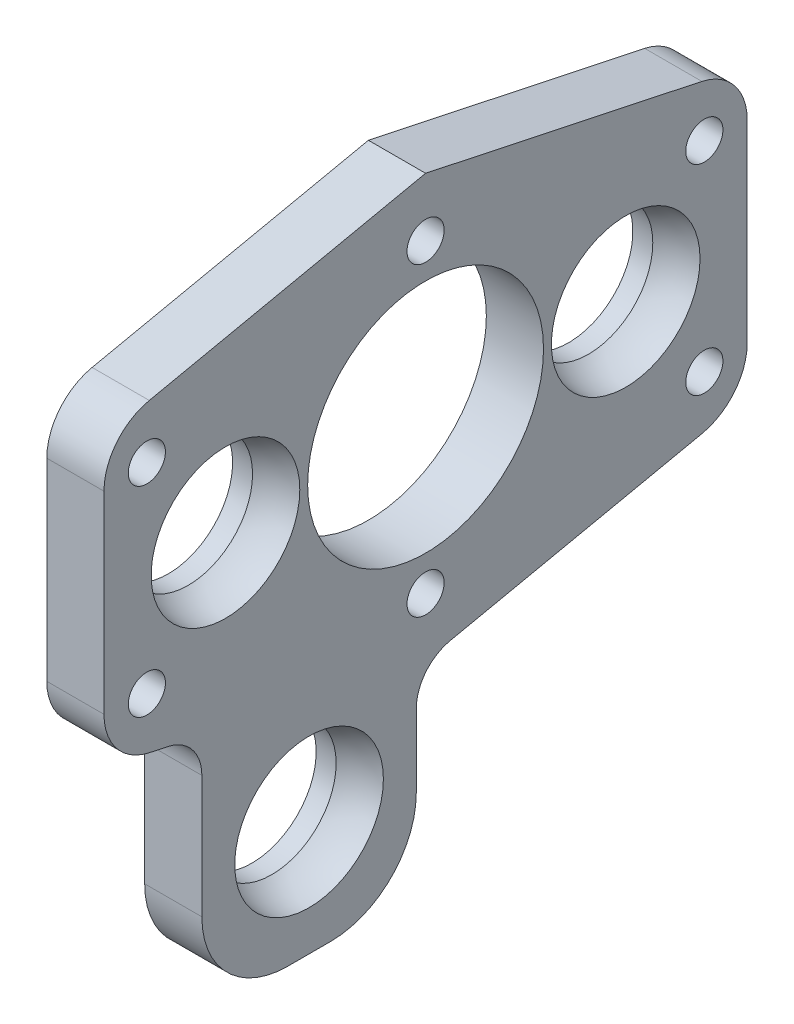
ISO-10303-21;
HEADER;
FILE_DESCRIPTION(('STEP AP214'),'2;1');
FILE_NAME('part.step','',(''),(''),'','','');
FILE_SCHEMA(('AUTOMOTIVE_DESIGN { 1 0 10303 214 1 1 1 1 }'));
ENDSEC;
DATA;
#1=APPLICATION_CONTEXT('core data for automotive mechanical design processes');
#2=APPLICATION_PROTOCOL_DEFINITION('international standard','automotive_design',2000,#1);
#3=PRODUCT_CONTEXT('',#1,'mechanical');
#4=PRODUCT('Part','Part','',(#3));
#5=PRODUCT_RELATED_PRODUCT_CATEGORY('part','',(#4));
#6=PRODUCT_DEFINITION_FORMATION('','',#4);
#7=PRODUCT_DEFINITION_CONTEXT('part definition',#1,'design');
#8=PRODUCT_DEFINITION('design','',#6,#7);
#9=PRODUCT_DEFINITION_SHAPE('','',#8);
#10=(LENGTH_UNIT() NAMED_UNIT(*) SI_UNIT(.MILLI.,.METRE.));
#11=(NAMED_UNIT(*) PLANE_ANGLE_UNIT() SI_UNIT($,.RADIAN.));
#12=(NAMED_UNIT(*) SI_UNIT($,.STERADIAN.) SOLID_ANGLE_UNIT());
#13=UNCERTAINTY_MEASURE_WITH_UNIT(LENGTH_MEASURE(1.E-05),#10,'distance_accuracy_value','');
#14=(GEOMETRIC_REPRESENTATION_CONTEXT(3) GLOBAL_UNCERTAINTY_ASSIGNED_CONTEXT((#13)) GLOBAL_UNIT_ASSIGNED_CONTEXT((#10,
#11,#12)) REPRESENTATION_CONTEXT('',''));
#15=CARTESIAN_POINT('',(0.,0.,0.));
#16=DIRECTION('',(0.,0.,1.));
#17=DIRECTION('',(1.,0.,0.));
#18=AXIS2_PLACEMENT_3D('',#15,#16,#17);
#19=CARTESIAN_POINT('',(4.,-28.2690306373786,-5.99265255801159));
#20=DIRECTION('',(0.,0.978260869565218,0.207378087264554));
#21=DIRECTION('',(0.,-0.207378087264554,0.978260869565218));
#22=AXIS2_PLACEMENT_3D('',#19,#20,#21);
#23=PLANE('',#22);
#24=DIRECTION('',(0.,0.207378087264554,-0.978260869565218));
#25=VECTOR('',#24,1.);
#26=CARTESIAN_POINT('',(4.,-28.2690306373786,-5.99265255801159));
#27=LINE('',#26,#25);
#28=CARTESIAN_POINT('',(4.,-24.4038726556208,-24.2256918251629));
#29=VERTEX_POINT('',#28);
#30=CARTESIAN_POINT('',(4.,-20.672100546187,-41.8295123490582));
#31=VERTEX_POINT('',#30);
#32=EDGE_CURVE('E186',#29,#31,#27,.T.);
#33=ORIENTED_EDGE('',*,*,#32,.F.);
#34=DIRECTION('',(-1.,0.,0.));
#35=VECTOR('',#34,1.);
#36=CARTESIAN_POINT('',(4.,-24.4038726556208,-24.2256918251629));
#37=LINE('',#36,#35);
#38=CARTESIAN_POINT('',(0.,-24.4038726556208,-24.2256918251629));
#39=VERTEX_POINT('',#38);
#40=EDGE_CURVE('E321',#29,#39,#37,.T.);
#41=ORIENTED_EDGE('',*,*,#40,.T.);
#42=DIRECTION('',(0.,0.207378087264554,-0.978260869565218));
#43=VECTOR('',#42,1.);
#44=CARTESIAN_POINT('',(0.,-28.2690306373786,-5.99265255801159));
#45=LINE('',#44,#43);
#46=CARTESIAN_POINT('',(0.,-20.672100546187,-41.8295123490582));
#47=VERTEX_POINT('',#46);
#48=EDGE_CURVE('E212',#39,#47,#45,.T.);
#49=ORIENTED_EDGE('',*,*,#48,.T.);
#50=DIRECTION('',(-1.,0.,0.));
#51=VECTOR('',#50,1.);
#52=CARTESIAN_POINT('',(4.,-20.672100546187,-41.8295123490582));
#53=LINE('',#52,#51);
#54=EDGE_CURVE('E307',#47,#31,#53,.F.);
#55=ORIENTED_EDGE('',*,*,#54,.T.);
#56=EDGE_LOOP('',(#33,#41,#49,#55));
#57=FACE_BOUND('',#56,.T.);
#58=ADVANCED_FACE('F35',(#57),#23,.F.);
#59=CARTESIAN_POINT('',(4.,0.,-45.));
#60=DIRECTION('',(0.,0.,-1.));
#61=DIRECTION('',(-1.,0.,0.));
#62=AXIS2_PLACEMENT_3D('',#59,#60,#61);
#63=PLANE('',#62);
#64=DIRECTION('',(0.,-1.,0.));
#65=VECTOR('',#64,1.);
#66=CARTESIAN_POINT('',(4.,0.,-45.));
#67=LINE('',#66,#65);
#68=CARTESIAN_POINT('',(4.,-3.24094293207383,-45.));
#69=VERTEX_POINT('',#68);
#70=CARTESIAN_POINT('',(4.,-16.7590570679262,-45.));
#71=VERTEX_POINT('',#70);
#72=EDGE_CURVE('E183',#69,#71,#67,.T.);
#73=ORIENTED_EDGE('',*,*,#72,.T.);
#74=DIRECTION('',(-1.,0.,0.));
#75=VECTOR('',#74,1.);
#76=CARTESIAN_POINT('',(0.,-16.7590570679262,-45.));
#77=LINE('',#76,#75);
#78=CARTESIAN_POINT('',(0.,-16.7590570679262,-45.));
#79=VERTEX_POINT('',#78);
#80=EDGE_CURVE('E304',#71,#79,#77,.T.);
#81=ORIENTED_EDGE('',*,*,#80,.T.);
#82=DIRECTION('',(0.,-1.,0.));
#83=VECTOR('',#82,1.);
#84=CARTESIAN_POINT('',(0.,0.,-45.));
#85=LINE('',#84,#83);
#86=CARTESIAN_POINT('',(0.,-3.24094293207383,-45.));
#87=VERTEX_POINT('',#86);
#88=EDGE_CURVE('E214',#87,#79,#85,.T.);
#89=ORIENTED_EDGE('',*,*,#88,.F.);
#90=DIRECTION('',(-1.,0.,0.));
#91=VECTOR('',#90,1.);
#92=CARTESIAN_POINT('',(4.,-3.24094293207383,-45.));
#93=LINE('',#92,#91);
#94=EDGE_CURVE('E302',#87,#69,#93,.F.);
#95=ORIENTED_EDGE('',*,*,#94,.T.);
#96=EDGE_LOOP('',(#73,#81,#89,#95));
#97=FACE_BOUND('',#96,.T.);
#98=ADVANCED_FACE('F339',(#97),#63,.T.);
#99=CARTESIAN_POINT('',(4.,9.12914405892871,-1.93525519848772));
#100=DIRECTION('',(0.,0.978260869565218,-0.207378087264554));
#101=DIRECTION('',(0.,0.207378087264554,0.978260869565218));
#102=AXIS2_PLACEMENT_3D('',#99,#100,#101);
#103=PLANE('',#102);
#104=DIRECTION('',(0.,-0.207378087264554,-0.978260869565218));
#105=VECTOR('',#104,1.);
#106=CARTESIAN_POINT('',(4.,9.12914405892871,-1.93525519848772));
#107=LINE('',#106,#105);
#108=CARTESIAN_POINT('',(4.,4.76969600708473,-22.5));
#109=VERTEX_POINT('',#108);
#110=CARTESIAN_POINT('',(4.,0.672100546187042,-41.8295123490582));
#111=VERTEX_POINT('',#110);
#112=EDGE_CURVE('E166',#109,#111,#107,.T.);
#113=ORIENTED_EDGE('',*,*,#112,.T.);
#114=DIRECTION('',(-1.,0.,0.));
#115=VECTOR('',#114,1.);
#116=CARTESIAN_POINT('',(4.,0.672100546187044,-41.8295123490582));
#117=LINE('',#116,#115);
#118=CARTESIAN_POINT('',(0.,0.672100546187042,-41.8295123490582));
#119=VERTEX_POINT('',#118);
#120=EDGE_CURVE('E310',#111,#119,#117,.T.);
#121=ORIENTED_EDGE('',*,*,#120,.T.);
#122=DIRECTION('',(0.,-0.207378087264554,-0.978260869565218));
#123=VECTOR('',#122,1.);
#124=CARTESIAN_POINT('',(0.,9.12914405892871,-1.93525519848772));
#125=LINE('',#124,#123);
#126=CARTESIAN_POINT('',(0.,4.76969600708473,-22.5));
#127=VERTEX_POINT('',#126);
#128=EDGE_CURVE('E174',#127,#119,#125,.T.);
#129=ORIENTED_EDGE('',*,*,#128,.F.);
#130=DIRECTION('',(-1.,0.,0.));
#131=VECTOR('',#130,1.);
#132=CARTESIAN_POINT('',(4.,4.76969600708473,-22.5));
#133=LINE('',#132,#131);
#134=EDGE_CURVE('E158',#109,#127,#133,.T.);
#135=ORIENTED_EDGE('',*,*,#134,.F.);
#136=EDGE_LOOP('',(#113,#121,#129,#135));
#137=FACE_BOUND('',#136,.T.);
#138=ADVANCED_FACE('F170',(#137),#103,.T.);
#139=CARTESIAN_POINT('',(4.,0.,0.));
#140=DIRECTION('',(0.,0.978260869565218,0.207378087264554));
#141=DIRECTION('',(0.,-0.207378087264554,0.978260869565218));
#142=AXIS2_PLACEMENT_3D('',#139,#140,#141);
#143=PLANE('',#142);
#144=DIRECTION('',(0.,0.207378087264554,-0.978260869565218));
#145=VECTOR('',#144,1.);
#146=CARTESIAN_POINT('',(0.,0.,0.));
#147=LINE('',#146,#145);
#148=CARTESIAN_POINT('',(0.,0.672100546187044,-3.17048765094179));
#149=VERTEX_POINT('',#148);
#150=EDGE_CURVE('E219',#149,#127,#147,.T.);
#151=ORIENTED_EDGE('',*,*,#150,.F.);
#152=DIRECTION('',(-1.,0.,0.));
#153=VECTOR('',#152,1.);
#154=CARTESIAN_POINT('',(4.,0.672100546187044,-3.17048765094179));
#155=LINE('',#154,#153);
#156=CARTESIAN_POINT('',(4.,0.672100546187044,-3.17048765094179));
#157=VERTEX_POINT('',#156);
#158=EDGE_CURVE('E161',#149,#157,#155,.F.);
#159=ORIENTED_EDGE('',*,*,#158,.T.);
#160=DIRECTION('',(0.,0.207378087264554,-0.978260869565218));
#161=VECTOR('',#160,1.);
#162=CARTESIAN_POINT('',(4.,0.,0.));
#163=LINE('',#162,#161);
#164=EDGE_CURVE('E154',#157,#109,#163,.T.);
#165=ORIENTED_EDGE('',*,*,#164,.T.);
#166=ORIENTED_EDGE('',*,*,#134,.T.);
#167=EDGE_LOOP('',(#151,#159,#165,#166));
#168=FACE_BOUND('',#167,.T.);
#169=ADVANCED_FACE('F157',(#168),#143,.T.);
#170=CARTESIAN_POINT('',(4.,0.,0.));
#171=DIRECTION('',(0.,0.,-1.));
#172=DIRECTION('',(0.,1.,0.));
#173=AXIS2_PLACEMENT_3D('',#170,#171,#172);
#174=PLANE('',#173);
#175=DIRECTION('',(0.,-1.,0.));
#176=VECTOR('',#175,1.);
#177=CARTESIAN_POINT('',(4.,0.,0.));
#178=LINE('',#177,#176);
#179=CARTESIAN_POINT('',(4.,-3.24094293207383,0.));
#180=VERTEX_POINT('',#179);
#181=CARTESIAN_POINT('',(4.,-16.7590570679262,0.));
#182=VERTEX_POINT('',#181);
#183=EDGE_CURVE('E165',#180,#182,#178,.T.);
#184=ORIENTED_EDGE('',*,*,#183,.F.);
#185=DIRECTION('',(-1.,0.,0.));
#186=VECTOR('',#185,1.);
#187=CARTESIAN_POINT('',(0.,-3.24094293207383,0.));
#188=LINE('',#187,#186);
#189=CARTESIAN_POINT('',(0.,-3.24094293207383,0.));
#190=VERTEX_POINT('',#189);
#191=EDGE_CURVE('E279',#180,#190,#188,.T.);
#192=ORIENTED_EDGE('',*,*,#191,.T.);
#193=DIRECTION('',(0.,-1.,0.));
#194=VECTOR('',#193,1.);
#195=CARTESIAN_POINT('',(0.,0.,0.));
#196=LINE('',#195,#194);
#197=CARTESIAN_POINT('',(0.,-16.7590570679262,0.));
#198=VERTEX_POINT('',#197);
#199=EDGE_CURVE('E221',#190,#198,#196,.T.);
#200=ORIENTED_EDGE('',*,*,#199,.T.);
#201=DIRECTION('',(-1.,0.,0.));
#202=VECTOR('',#201,1.);
#203=CARTESIAN_POINT('',(4.,-16.7590570679262,0.));
#204=LINE('',#203,#202);
#205=EDGE_CURVE('E277',#198,#182,#204,.F.);
#206=ORIENTED_EDGE('',*,*,#205,.T.);
#207=EDGE_LOOP('',(#184,#192,#200,#206));
#208=FACE_BOUND('',#207,.T.);
#209=ADVANCED_FACE('F349',(#208),#174,.F.);
#210=CARTESIAN_POINT('',(4.,-3.,-3.));
#211=DIRECTION('',(-1.,0.,0.));
#212=DIRECTION('',(0.,0.,1.));
#213=AXIS2_PLACEMENT_3D('',#210,#211,#212);
#214=CYLINDRICAL_SURFACE('',#213,1.3);
#215=CARTESIAN_POINT('',(4.,-3.,-3.));
#216=DIRECTION('',(1.,0.,0.));
#217=DIRECTION('',(0.,0.,-1.));
#218=AXIS2_PLACEMENT_3D('',#215,#216,#217);
#219=CIRCLE('',#218,1.3);
#220=CARTESIAN_POINT('',(4.,-3.,-4.3));
#221=VERTEX_POINT('',#220);
#222=EDGE_CURVE('E207',#221,#221,#219,.T.);
#223=ORIENTED_EDGE('',*,*,#222,.T.);
#224=EDGE_LOOP('',(#223));
#225=FACE_BOUND('',#224,.T.);
#226=CARTESIAN_POINT('',(0.,-3.,-3.));
#227=DIRECTION('',(1.,0.,0.));
#228=DIRECTION('',(0.,0.,-1.));
#229=AXIS2_PLACEMENT_3D('',#226,#227,#228);
#230=CIRCLE('',#229,1.3);
#231=CARTESIAN_POINT('',(0.,-3.,-4.3));
#232=VERTEX_POINT('',#231);
#233=EDGE_CURVE('E239',#232,#232,#230,.T.);
#234=ORIENTED_EDGE('',*,*,#233,.F.);
#235=EDGE_LOOP('',(#234));
#236=FACE_BOUND('',#235,.T.);
#237=ADVANCED_FACE('F489',(#225,#236),#214,.F.);
#238=CARTESIAN_POINT('',(4.,-3.,-42.));
#239=DIRECTION('',(-1.,0.,0.));
#240=DIRECTION('',(0.,0.,1.));
#241=AXIS2_PLACEMENT_3D('',#238,#239,#240);
#242=CYLINDRICAL_SURFACE('',#241,1.29999999999999);
#243=CARTESIAN_POINT('',(4.,-3.,-42.));
#244=DIRECTION('',(1.,0.,0.));
#245=DIRECTION('',(0.,0.,-1.));
#246=AXIS2_PLACEMENT_3D('',#243,#244,#245);
#247=CIRCLE('',#246,1.29999999999999);
#248=CARTESIAN_POINT('',(4.,-3.,-43.3));
#249=VERTEX_POINT('',#248);
#250=EDGE_CURVE('E204',#249,#249,#247,.T.);
#251=ORIENTED_EDGE('',*,*,#250,.T.);
#252=EDGE_LOOP('',(#251));
#253=FACE_BOUND('',#252,.T.);
#254=CARTESIAN_POINT('',(0.,-3.,-42.));
#255=DIRECTION('',(1.,0.,0.));
#256=DIRECTION('',(0.,0.,-1.));
#257=AXIS2_PLACEMENT_3D('',#254,#255,#256);
#258=CIRCLE('',#257,1.29999999999999);
#259=CARTESIAN_POINT('',(0.,-3.,-43.3));
#260=VERTEX_POINT('',#259);
#261=EDGE_CURVE('E236',#260,#260,#258,.T.);
#262=ORIENTED_EDGE('',*,*,#261,.F.);
#263=EDGE_LOOP('',(#262));
#264=FACE_BOUND('',#263,.T.);
#265=ADVANCED_FACE('F492',(#253,#264),#242,.F.);
#266=CARTESIAN_POINT('',(4.,-17.,-42.0000000000003));
#267=DIRECTION('',(-1.,0.,0.));
#268=DIRECTION('',(0.,0.,1.));
#269=AXIS2_PLACEMENT_3D('',#266,#267,#268);
#270=CYLINDRICAL_SURFACE('',#269,1.3);
#271=CARTESIAN_POINT('',(4.,-17.,-42.0000000000003));
#272=DIRECTION('',(1.,0.,0.));
#273=DIRECTION('',(0.,0.,-1.));
#274=AXIS2_PLACEMENT_3D('',#271,#272,#273);
#275=CIRCLE('',#274,1.3);
#276=CARTESIAN_POINT('',(4.,-17.,-43.3000000000003));
#277=VERTEX_POINT('',#276);
#278=EDGE_CURVE('E201',#277,#277,#275,.T.);
#279=ORIENTED_EDGE('',*,*,#278,.T.);
#280=EDGE_LOOP('',(#279));
#281=FACE_BOUND('',#280,.T.);
#282=CARTESIAN_POINT('',(0.,-17.,-42.0000000000003));
#283=DIRECTION('',(1.,0.,0.));
#284=DIRECTION('',(0.,0.,-1.));
#285=AXIS2_PLACEMENT_3D('',#282,#283,#284);
#286=CIRCLE('',#285,1.3);
#287=CARTESIAN_POINT('',(0.,-17.,-43.3000000000003));
#288=VERTEX_POINT('',#287);
#289=EDGE_CURVE('E233',#288,#288,#286,.T.);
#290=ORIENTED_EDGE('',*,*,#289,.F.);
#291=EDGE_LOOP('',(#290));
#292=FACE_BOUND('',#291,.T.);
#293=ADVANCED_FACE('F496',(#281,#292),#270,.F.);
#294=CARTESIAN_POINT('',(4.,-17.,-3.00000000000015));
#295=DIRECTION('',(-1.,0.,0.));
#296=DIRECTION('',(0.,0.,1.));
#297=AXIS2_PLACEMENT_3D('',#294,#295,#296);
#298=CYLINDRICAL_SURFACE('',#297,1.3);
#299=CARTESIAN_POINT('',(4.,-17.,-3.00000000000015));
#300=DIRECTION('',(1.,0.,0.));
#301=DIRECTION('',(0.,0.,-1.));
#302=AXIS2_PLACEMENT_3D('',#299,#300,#301);
#303=CIRCLE('',#302,1.3);
#304=CARTESIAN_POINT('',(4.,-17.,-4.30000000000015));
#305=VERTEX_POINT('',#304);
#306=EDGE_CURVE('E198',#305,#305,#303,.T.);
#307=ORIENTED_EDGE('',*,*,#306,.T.);
#308=EDGE_LOOP('',(#307));
#309=FACE_BOUND('',#308,.T.);
#310=CARTESIAN_POINT('',(0.,-17.,-3.00000000000015));
#311=DIRECTION('',(1.,0.,0.));
#312=DIRECTION('',(0.,0.,-1.));
#313=AXIS2_PLACEMENT_3D('',#310,#311,#312);
#314=CIRCLE('',#313,1.3);
#315=CARTESIAN_POINT('',(0.,-17.,-4.30000000000015));
#316=VERTEX_POINT('',#315);
#317=EDGE_CURVE('E230',#316,#316,#314,.T.);
#318=ORIENTED_EDGE('',*,*,#317,.F.);
#319=EDGE_LOOP('',(#318));
#320=FACE_BOUND('',#319,.T.);
#321=ADVANCED_FACE('F500',(#309,#320),#298,.F.);
#322=CARTESIAN_POINT('',(4.,-20.6808071181958,-22.5));
#323=DIRECTION('',(-1.,0.,0.));
#324=DIRECTION('',(0.,0.,1.));
#325=AXIS2_PLACEMENT_3D('',#322,#323,#324);
#326=CYLINDRICAL_SURFACE('',#325,1.3);
#327=CARTESIAN_POINT('',(4.,-20.6808071181958,-22.5));
#328=DIRECTION('',(1.,0.,0.));
#329=DIRECTION('',(0.,0.,-1.));
#330=AXIS2_PLACEMENT_3D('',#327,#328,#329);
#331=CIRCLE('',#330,1.3);
#332=CARTESIAN_POINT('',(4.,-20.6808071181958,-23.8));
#333=VERTEX_POINT('',#332);
#334=EDGE_CURVE('E195',#333,#333,#331,.T.);
#335=ORIENTED_EDGE('',*,*,#334,.T.);
#336=EDGE_LOOP('',(#335));
#337=FACE_BOUND('',#336,.T.);
#338=CARTESIAN_POINT('',(0.,-20.6808071181958,-22.5));
#339=DIRECTION('',(1.,0.,0.));
#340=DIRECTION('',(0.,0.,-1.));
#341=AXIS2_PLACEMENT_3D('',#338,#339,#340);
#342=CIRCLE('',#341,1.3);
#343=CARTESIAN_POINT('',(0.,-20.6808071181958,-23.8));
#344=VERTEX_POINT('',#343);
#345=EDGE_CURVE('E227',#344,#344,#342,.T.);
#346=ORIENTED_EDGE('',*,*,#345,.F.);
#347=EDGE_LOOP('',(#346));
#348=FACE_BOUND('',#347,.T.);
#349=ADVANCED_FACE('F504',(#337,#348),#326,.F.);
#350=CARTESIAN_POINT('',(4.,-19.1398865784499,4.05739735952387));
#351=DIRECTION('',(0.,0.978260869565218,-0.207378087264554));
#352=DIRECTION('',(0.,0.207378087264554,0.978260869565218));
#353=AXIS2_PLACEMENT_3D('',#350,#351,#352);
#354=PLANE('',#353);
#355=DIRECTION('',(0.,-0.207378087264554,-0.978260869565218));
#356=VECTOR('',#355,1.);
#357=CARTESIAN_POINT('',(0.,-19.1398865784499,4.05739735952387));
#358=LINE('',#357,#356);
#359=CARTESIAN_POINT('',(0.,-20.672100546187,-3.17048765094179));
#360=VERTEX_POINT('',#359);
#361=CARTESIAN_POINT('',(0.,-20.9475712012116,-4.46996034875019));
#362=VERTEX_POINT('',#361);
#363=EDGE_CURVE('E224',#360,#362,#358,.T.);
#364=ORIENTED_EDGE('',*,*,#363,.T.);
#365=DIRECTION('',(1.,0.,0.));
#366=VECTOR('',#365,1.);
#367=CARTESIAN_POINT('',(4.,-20.9475712012116,-4.46996034875019));
#368=LINE('',#367,#366);
#369=CARTESIAN_POINT('',(4.,-20.9475712012116,-4.46996034875019));
#370=VERTEX_POINT('',#369);
#371=EDGE_CURVE('E312',#362,#370,#368,.T.);
#372=ORIENTED_EDGE('',*,*,#371,.T.);
#373=DIRECTION('',(0.,-0.207378087264554,-0.978260869565218));
#374=VECTOR('',#373,1.);
#375=CARTESIAN_POINT('',(4.,-19.1398865784499,4.05739735952387));
#376=LINE('',#375,#374);
#377=CARTESIAN_POINT('',(4.,-20.672100546187,-3.17048765094179));
#378=VERTEX_POINT('',#377);
#379=EDGE_CURVE('E192',#378,#370,#376,.T.);
#380=ORIENTED_EDGE('',*,*,#379,.F.);
#381=DIRECTION('',(-1.,0.,0.));
#382=VECTOR('',#381,1.);
#383=CARTESIAN_POINT('',(4.,-20.672100546187,-3.17048765094179));
#384=LINE('',#383,#382);
#385=EDGE_CURVE('E299',#378,#360,#384,.T.);
#386=ORIENTED_EDGE('',*,*,#385,.T.);
#387=EDGE_LOOP('',(#364,#372,#380,#386));
#388=FACE_BOUND('',#387,.T.);
#389=ADVANCED_FACE('F356',(#388),#354,.F.);
#390=CARTESIAN_POINT('',(4.,0.680807118195841,-22.5));
#391=DIRECTION('',(-1.,0.,0.));
#392=DIRECTION('',(0.,0.,1.));
#393=AXIS2_PLACEMENT_3D('',#390,#391,#392);
#394=CYLINDRICAL_SURFACE('',#393,1.3);
#395=CARTESIAN_POINT('',(4.,0.680807118195841,-22.5));
#396=DIRECTION('',(1.,0.,0.));
#397=DIRECTION('',(0.,0.,-1.));
#398=AXIS2_PLACEMENT_3D('',#395,#396,#397);
#399=CIRCLE('',#398,1.3);
#400=CARTESIAN_POINT('',(4.,0.680807118195841,-23.8));
#401=VERTEX_POINT('',#400);
#402=EDGE_CURVE('E176',#401,#401,#399,.T.);
#403=ORIENTED_EDGE('',*,*,#402,.T.);
#404=EDGE_LOOP('',(#403));
#405=FACE_BOUND('',#404,.T.);
#406=CARTESIAN_POINT('',(0.,0.680807118195841,-22.5));
#407=DIRECTION('',(1.,0.,0.));
#408=DIRECTION('',(0.,0.,-1.));
#409=AXIS2_PLACEMENT_3D('',#406,#407,#408);
#410=CIRCLE('',#409,1.3);
#411=CARTESIAN_POINT('',(0.,0.680807118195841,-23.8));
#412=VERTEX_POINT('',#411);
#413=EDGE_CURVE('E242',#412,#412,#410,.T.);
#414=ORIENTED_EDGE('',*,*,#413,.F.);
#415=EDGE_LOOP('',(#414));
#416=FACE_BOUND('',#415,.T.);
#417=ADVANCED_FACE('F478',(#405,#416),#394,.F.);
#418=CARTESIAN_POINT('',(4.,0.,0.));
#419=DIRECTION('',(1.,0.,0.));
#420=DIRECTION('',(0.,0.,-1.));
#421=AXIS2_PLACEMENT_3D('',#418,#419,#420);
#422=PLANE('',#421);
#423=CARTESIAN_POINT('',(4.,-30.4516466108519,-14.3478260869565));
#424=DIRECTION('',(1.,0.,0.));
#425=DIRECTION('',(0.,0.,-1.));
#426=AXIS2_PLACEMENT_3D('',#423,#424,#425);
#427=CIRCLE('',#426,5.2);
#428=CARTESIAN_POINT('',(4.,-30.4516466108519,-19.5478260869565));
#429=VERTEX_POINT('',#428);
#430=EDGE_CURVE('E257',#429,#429,#427,.T.);
#431=ORIENTED_EDGE('',*,*,#430,.F.);
#432=EDGE_LOOP('',(#431));
#433=FACE_BOUND('',#432,.T.);
#434=CARTESIAN_POINT('',(4.,-10.,-22.5));
#435=DIRECTION('',(1.,0.,0.));
#436=DIRECTION('',(0.,0.,-1.));
#437=AXIS2_PLACEMENT_3D('',#434,#435,#436);
#438=CIRCLE('',#437,8.25);
#439=CARTESIAN_POINT('',(4.,-10.,-30.75));
#440=VERTEX_POINT('',#439);
#441=EDGE_CURVE('E248',#440,#440,#438,.T.);
#442=ORIENTED_EDGE('',*,*,#441,.F.);
#443=EDGE_LOOP('',(#442));
#444=FACE_BOUND('',#443,.T.);
#445=CARTESIAN_POINT('',(4.,-10.,-36.5));
#446=DIRECTION('',(1.,0.,0.));
#447=DIRECTION('',(0.,0.,-1.));
#448=AXIS2_PLACEMENT_3D('',#445,#446,#447);
#449=CIRCLE('',#448,5.2);
#450=CARTESIAN_POINT('',(4.,-10.,-41.7));
#451=VERTEX_POINT('',#450);
#452=EDGE_CURVE('E390',#451,#451,#449,.F.);
#453=ORIENTED_EDGE('',*,*,#452,.T.);
#454=EDGE_LOOP('',(#453));
#455=FACE_BOUND('',#454,.T.);
#456=CARTESIAN_POINT('',(4.,-10.,-8.5));
#457=DIRECTION('',(1.,0.,0.));
#458=DIRECTION('',(0.,0.,-1.));
#459=AXIS2_PLACEMENT_3D('',#456,#457,#458);
#460=CIRCLE('',#459,5.2);
#461=CARTESIAN_POINT('',(4.,-10.,-13.7));
#462=VERTEX_POINT('',#461);
#463=EDGE_CURVE('E215',#462,#462,#460,.F.);
#464=ORIENTED_EDGE('',*,*,#463,.T.);
#465=EDGE_LOOP('',(#464));
#466=FACE_BOUND('',#465,.T.);
#467=ORIENTED_EDGE('',*,*,#164,.F.);
#468=CARTESIAN_POINT('',(4.,-3.24094293207383,-4.));
#469=DIRECTION('',(1.,0.,0.));
#470=DIRECTION('',(0.,0.,-1.));
#471=AXIS2_PLACEMENT_3D('',#468,#469,#470);
#472=CIRCLE('',#471,4.);
#473=EDGE_CURVE('E297',#157,#180,#472,.T.);
#474=ORIENTED_EDGE('',*,*,#473,.T.);
#475=ORIENTED_EDGE('',*,*,#183,.T.);
#476=CARTESIAN_POINT('',(4.,-16.7590570679262,-4.));
#477=DIRECTION('',(1.,0.,0.));
#478=DIRECTION('',(0.,0.,-1.));
#479=AXIS2_PLACEMENT_3D('',#476,#477,#478);
#480=CIRCLE('',#479,4.);
#481=EDGE_CURVE('E295',#182,#378,#480,.T.);
#482=ORIENTED_EDGE('',*,*,#481,.T.);
#483=ORIENTED_EDGE('',*,*,#379,.T.);
#484=CARTESIAN_POINT('',(4.,-23.8823538099072,-3.84782608695653));
#485=DIRECTION('',(1.,0.,0.));
#486=DIRECTION('',(0.,0.,-1.));
#487=AXIS2_PLACEMENT_3D('',#484,#485,#486);
#488=CIRCLE('',#487,3.);
#489=CARTESIAN_POINT('',(4.,-23.8823538099072,-6.84782608695653));
#490=VERTEX_POINT('',#489);
#491=EDGE_CURVE('E317',#370,#490,#488,.F.);
#492=ORIENTED_EDGE('',*,*,#491,.T.);
#493=DIRECTION('',(0.,-1.,0.));
#494=VECTOR('',#493,1.);
#495=CARTESIAN_POINT('',(4.,-38.4516466108519,-6.84782608695653));
#496=LINE('',#495,#494);
#497=CARTESIAN_POINT('',(4.,-32.4516466108519,-6.84782608695653));
#498=VERTEX_POINT('',#497);
#499=EDGE_CURVE('E364',#490,#498,#496,.T.);
#500=ORIENTED_EDGE('',*,*,#499,.T.);
#501=CARTESIAN_POINT('',(4.,-32.4516466108519,-12.8478260869565));
#502=DIRECTION('',(1.,0.,0.));
#503=DIRECTION('',(0.,0.,-1.));
#504=AXIS2_PLACEMENT_3D('',#501,#502,#503);
#505=CIRCLE('',#504,6.);
#506=CARTESIAN_POINT('',(4.,-38.4516466108519,-12.8478260869565));
#507=VERTEX_POINT('',#506);
#508=EDGE_CURVE('E263',#498,#507,#505,.T.);
#509=ORIENTED_EDGE('',*,*,#508,.T.);
#510=DIRECTION('',(0.,0.,-1.));
#511=VECTOR('',#510,1.);
#512=CARTESIAN_POINT('',(4.,-38.4516466108519,-21.8478260869565));
#513=LINE('',#512,#511);
#514=CARTESIAN_POINT('',(4.,-38.4516466108519,-15.8478260869565));
#515=VERTEX_POINT('',#514);
#516=EDGE_CURVE('E370',#507,#515,#513,.T.);
#517=ORIENTED_EDGE('',*,*,#516,.T.);
#518=CARTESIAN_POINT('',(4.,-32.4516466108519,-15.8478260869565));
#519=DIRECTION('',(1.,0.,0.));
#520=DIRECTION('',(0.,0.,-1.));
#521=AXIS2_PLACEMENT_3D('',#518,#519,#520);
#522=CIRCLE('',#521,6.);
#523=CARTESIAN_POINT('',(4.,-32.4516466108519,-21.8478260869565));
#524=VERTEX_POINT('',#523);
#525=EDGE_CURVE('E265',#515,#524,#522,.T.);
#526=ORIENTED_EDGE('',*,*,#525,.T.);
#527=DIRECTION('',(0.,1.,0.));
#528=VECTOR('',#527,1.);
#529=CARTESIAN_POINT('',(4.,-24.6314439489084,-21.8478260869565));
#530=LINE('',#529,#528);
#531=CARTESIAN_POINT('',(4.,-27.3386552643165,-21.8478260869565));
#532=VERTEX_POINT('',#531);
#533=EDGE_CURVE('E373',#524,#532,#530,.T.);
#534=ORIENTED_EDGE('',*,*,#533,.T.);
#535=CARTESIAN_POINT('',(4.,-27.3386552643165,-24.8478260869565));
#536=DIRECTION('',(1.,0.,0.));
#537=DIRECTION('',(0.,0.,-1.));
#538=AXIS2_PLACEMENT_3D('',#535,#536,#537);
#539=CIRCLE('',#538,3.);
#540=EDGE_CURVE('E11',#532,#29,#539,.F.);
#541=ORIENTED_EDGE('',*,*,#540,.T.);
#542=ORIENTED_EDGE('',*,*,#32,.T.);
#543=CARTESIAN_POINT('',(4.,-16.7590570679262,-41.));
#544=DIRECTION('',(1.,0.,0.));
#545=DIRECTION('',(0.,0.,-1.));
#546=AXIS2_PLACEMENT_3D('',#543,#544,#545);
#547=CIRCLE('',#546,4.);
#548=EDGE_CURVE('E293',#31,#71,#547,.T.);
#549=ORIENTED_EDGE('',*,*,#548,.T.);
#550=ORIENTED_EDGE('',*,*,#72,.F.);
#551=CARTESIAN_POINT('',(4.,-3.24094293207383,-41.));
#552=DIRECTION('',(1.,0.,0.));
#553=DIRECTION('',(0.,0.,-1.));
#554=AXIS2_PLACEMENT_3D('',#551,#552,#553);
#555=CIRCLE('',#554,4.);
#556=EDGE_CURVE('E182',#69,#111,#555,.T.);
#557=ORIENTED_EDGE('',*,*,#556,.T.);
#558=ORIENTED_EDGE('',*,*,#112,.F.);
#559=EDGE_LOOP('',(#467,#474,#475,#482,#483,#492,#500,#509,#517,#526,#534,#541,#542,#549,#550,
#557,#558));
#560=FACE_BOUND('',#559,.T.);
#561=ORIENTED_EDGE('',*,*,#334,.F.);
#562=EDGE_LOOP('',(#561));
#563=FACE_BOUND('',#562,.T.);
#564=ORIENTED_EDGE('',*,*,#306,.F.);
#565=EDGE_LOOP('',(#564));
#566=FACE_BOUND('',#565,.T.);
#567=ORIENTED_EDGE('',*,*,#278,.F.);
#568=EDGE_LOOP('',(#567));
#569=FACE_BOUND('',#568,.T.);
#570=ORIENTED_EDGE('',*,*,#250,.F.);
#571=EDGE_LOOP('',(#570));
#572=FACE_BOUND('',#571,.T.);
#573=ORIENTED_EDGE('',*,*,#222,.F.);
#574=EDGE_LOOP('',(#573));
#575=FACE_BOUND('',#574,.T.);
#576=ORIENTED_EDGE('',*,*,#402,.F.);
#577=EDGE_LOOP('',(#576));
#578=FACE_BOUND('',#577,.T.);
#579=ADVANCED_FACE('F178',(#433,#444,#455,#466,#560,#563,#566,#569,#572,#575,#578),#422,.T.);
#580=CARTESIAN_POINT('',(0.,0.,0.));
#581=DIRECTION('',(1.,0.,0.));
#582=DIRECTION('',(0.,0.,-1.));
#583=AXIS2_PLACEMENT_3D('',#580,#581,#582);
#584=PLANE('',#583);
#585=CARTESIAN_POINT('',(0.,-30.4516466108519,-14.3478260869565));
#586=DIRECTION('',(-1.,0.,0.));
#587=DIRECTION('',(0.,0.,1.));
#588=AXIS2_PLACEMENT_3D('',#585,#586,#587);
#589=CIRCLE('',#588,4.5);
#590=CARTESIAN_POINT('',(0.,-30.4516466108519,-9.84782608695653));
#591=VERTEX_POINT('',#590);
#592=EDGE_CURVE('E258',#591,#591,#589,.T.);
#593=ORIENTED_EDGE('',*,*,#592,.F.);
#594=EDGE_LOOP('',(#593));
#595=FACE_BOUND('',#594,.T.);
#596=CARTESIAN_POINT('',(0.,-10.,-36.5));
#597=DIRECTION('',(-1.,0.,0.));
#598=DIRECTION('',(0.,0.,1.));
#599=AXIS2_PLACEMENT_3D('',#596,#597,#598);
#600=CIRCLE('',#599,4.5);
#601=CARTESIAN_POINT('',(0.,-10.,-32.));
#602=VERTEX_POINT('',#601);
#603=EDGE_CURVE('E253',#602,#602,#600,.T.);
#604=ORIENTED_EDGE('',*,*,#603,.F.);
#605=EDGE_LOOP('',(#604));
#606=FACE_BOUND('',#605,.T.);
#607=CARTESIAN_POINT('',(0.,-10.,-8.5));
#608=DIRECTION('',(-1.,0.,0.));
#609=DIRECTION('',(0.,0.,1.));
#610=AXIS2_PLACEMENT_3D('',#607,#608,#609);
#611=CIRCLE('',#610,4.5);
#612=CARTESIAN_POINT('',(0.,-10.,-4.));
#613=VERTEX_POINT('',#612);
#614=EDGE_CURVE('E249',#613,#613,#611,.T.);
#615=ORIENTED_EDGE('',*,*,#614,.F.);
#616=EDGE_LOOP('',(#615));
#617=FACE_BOUND('',#616,.T.);
#618=CARTESIAN_POINT('',(0.,-10.,-22.5));
#619=DIRECTION('',(1.,0.,0.));
#620=DIRECTION('',(0.,0.,-1.));
#621=AXIS2_PLACEMENT_3D('',#618,#619,#620);
#622=CIRCLE('',#621,8.25);
#623=CARTESIAN_POINT('',(0.,-10.,-30.75));
#624=VERTEX_POINT('',#623);
#625=EDGE_CURVE('E387',#624,#624,#622,.T.);
#626=ORIENTED_EDGE('',*,*,#625,.T.);
#627=EDGE_LOOP('',(#626));
#628=FACE_BOUND('',#627,.T.);
#629=ORIENTED_EDGE('',*,*,#199,.F.);
#630=CARTESIAN_POINT('',(0.,-3.24094293207383,-4.));
#631=DIRECTION('',(1.,0.,0.));
#632=DIRECTION('',(0.,0.,-1.));
#633=AXIS2_PLACEMENT_3D('',#630,#631,#632);
#634=CIRCLE('',#633,4.);
#635=EDGE_CURVE('E289',#190,#149,#634,.F.);
#636=ORIENTED_EDGE('',*,*,#635,.T.);
#637=ORIENTED_EDGE('',*,*,#150,.T.);
#638=ORIENTED_EDGE('',*,*,#128,.T.);
#639=CARTESIAN_POINT('',(0.,-3.24094293207383,-41.));
#640=DIRECTION('',(1.,0.,0.));
#641=DIRECTION('',(0.,0.,-1.));
#642=AXIS2_PLACEMENT_3D('',#639,#640,#641);
#643=CIRCLE('',#642,4.);
#644=EDGE_CURVE('E282',#119,#87,#643,.F.);
#645=ORIENTED_EDGE('',*,*,#644,.T.);
#646=ORIENTED_EDGE('',*,*,#88,.T.);
#647=CARTESIAN_POINT('',(0.,-16.7590570679262,-41.));
#648=DIRECTION('',(1.,0.,0.));
#649=DIRECTION('',(0.,0.,-1.));
#650=AXIS2_PLACEMENT_3D('',#647,#648,#649);
#651=CIRCLE('',#650,4.);
#652=EDGE_CURVE('E284',#79,#47,#651,.F.);
#653=ORIENTED_EDGE('',*,*,#652,.T.);
#654=ORIENTED_EDGE('',*,*,#48,.F.);
#655=CARTESIAN_POINT('',(0.,-27.3386552643165,-24.8478260869565));
#656=DIRECTION('',(1.,0.,0.));
#657=DIRECTION('',(0.,0.,-1.));
#658=AXIS2_PLACEMENT_3D('',#655,#656,#657);
#659=CIRCLE('',#658,3.);
#660=CARTESIAN_POINT('',(0.,-27.3386552643165,-21.8478260869565));
#661=VERTEX_POINT('',#660);
#662=EDGE_CURVE('E43',#39,#661,#659,.T.);
#663=ORIENTED_EDGE('',*,*,#662,.T.);
#664=DIRECTION('',(0.,1.,0.));
#665=VECTOR('',#664,1.);
#666=CARTESIAN_POINT('',(0.,-24.6314439489084,-21.8478260869565));
#667=LINE('',#666,#665);
#668=CARTESIAN_POINT('',(0.,-32.4516466108519,-21.8478260869565));
#669=VERTEX_POINT('',#668);
#670=EDGE_CURVE('E378',#669,#661,#667,.T.);
#671=ORIENTED_EDGE('',*,*,#670,.F.);
#672=CARTESIAN_POINT('',(0.,-32.4516466108519,-15.8478260869565));
#673=DIRECTION('',(1.,0.,0.));
#674=DIRECTION('',(0.,0.,-1.));
#675=AXIS2_PLACEMENT_3D('',#672,#673,#674);
#676=CIRCLE('',#675,6.);
#677=CARTESIAN_POINT('',(0.,-38.4516466108519,-15.8478260869565));
#678=VERTEX_POINT('',#677);
#679=EDGE_CURVE('E272',#669,#678,#676,.F.);
#680=ORIENTED_EDGE('',*,*,#679,.T.);
#681=DIRECTION('',(0.,0.,-1.));
#682=VECTOR('',#681,1.);
#683=CARTESIAN_POINT('',(0.,-38.4516466108519,-21.8478260869565));
#684=LINE('',#683,#682);
#685=CARTESIAN_POINT('',(0.,-38.4516466108519,-12.8478260869565));
#686=VERTEX_POINT('',#685);
#687=EDGE_CURVE('E451',#686,#678,#684,.T.);
#688=ORIENTED_EDGE('',*,*,#687,.F.);
#689=CARTESIAN_POINT('',(0.,-32.4516466108519,-12.8478260869565));
#690=DIRECTION('',(1.,0.,0.));
#691=DIRECTION('',(0.,0.,-1.));
#692=AXIS2_PLACEMENT_3D('',#689,#690,#691);
#693=CIRCLE('',#692,6.);
#694=CARTESIAN_POINT('',(0.,-32.4516466108519,-6.84782608695653));
#695=VERTEX_POINT('',#694);
#696=EDGE_CURVE('E269',#686,#695,#693,.F.);
#697=ORIENTED_EDGE('',*,*,#696,.T.);
#698=DIRECTION('',(0.,-1.,0.));
#699=VECTOR('',#698,1.);
#700=CARTESIAN_POINT('',(0.,-38.4516466108519,-6.84782608695653));
#701=LINE('',#700,#699);
#702=CARTESIAN_POINT('',(0.,-23.8823538099072,-6.84782608695653));
#703=VERTEX_POINT('',#702);
#704=EDGE_CURVE('E382',#703,#695,#701,.T.);
#705=ORIENTED_EDGE('',*,*,#704,.F.);
#706=CARTESIAN_POINT('',(0.,-23.8823538099072,-3.84782608695653));
#707=DIRECTION('',(1.,0.,0.));
#708=DIRECTION('',(0.,0.,-1.));
#709=AXIS2_PLACEMENT_3D('',#706,#707,#708);
#710=CIRCLE('',#709,3.);
#711=EDGE_CURVE('E319',#703,#362,#710,.T.);
#712=ORIENTED_EDGE('',*,*,#711,.T.);
#713=ORIENTED_EDGE('',*,*,#363,.F.);
#714=CARTESIAN_POINT('',(0.,-16.7590570679262,-4.));
#715=DIRECTION('',(1.,0.,0.));
#716=DIRECTION('',(0.,0.,-1.));
#717=AXIS2_PLACEMENT_3D('',#714,#715,#716);
#718=CIRCLE('',#717,4.);
#719=EDGE_CURVE('E287',#360,#198,#718,.F.);
#720=ORIENTED_EDGE('',*,*,#719,.T.);
#721=EDGE_LOOP('',(#629,#636,#637,#638,#645,#646,#653,#654,#663,#671,#680,#688,#697,#705,#712,
#713,#720));
#722=FACE_BOUND('',#721,.T.);
#723=ORIENTED_EDGE('',*,*,#345,.T.);
#724=EDGE_LOOP('',(#723));
#725=FACE_BOUND('',#724,.T.);
#726=ORIENTED_EDGE('',*,*,#317,.T.);
#727=EDGE_LOOP('',(#726));
#728=FACE_BOUND('',#727,.T.);
#729=ORIENTED_EDGE('',*,*,#289,.T.);
#730=EDGE_LOOP('',(#729));
#731=FACE_BOUND('',#730,.T.);
#732=ORIENTED_EDGE('',*,*,#261,.T.);
#733=EDGE_LOOP('',(#732));
#734=FACE_BOUND('',#733,.T.);
#735=ORIENTED_EDGE('',*,*,#233,.T.);
#736=EDGE_LOOP('',(#735));
#737=FACE_BOUND('',#736,.T.);
#738=ORIENTED_EDGE('',*,*,#413,.T.);
#739=EDGE_LOOP('',(#738));
#740=FACE_BOUND('',#739,.T.);
#741=ADVANCED_FACE('F330',(#595,#606,#617,#628,#722,#725,#728,#731,#734,#737,#740),#584,.F.);
#742=CARTESIAN_POINT('',(4.,-10.,-8.5));
#743=DIRECTION('',(0.,0.,1.));
#744=DIRECTION('',(0.,1.,0.));
#745=AXIS2_PLACEMENT_3D('',#742,#743,#744);
#746=SPHERICAL_SURFACE('',#745,5.2);
#747=CARTESIAN_POINT('',(4.,-10.,-8.5));
#748=DIRECTION('',(1.,0.,0.));
#749=DIRECTION('',(0.,0.,-1.));
#750=AXIS2_PLACEMENT_3D('',#747,#748,#749);
#751=SPHERICAL_SURFACE('',#750,5.2);
#752=CARTESIAN_POINT('',(1.39423715584092,-10.,-8.5));
#753=DIRECTION('',(1.,0.,0.));
#754=DIRECTION('',(0.,0.,-1.));
#755=AXIS2_PLACEMENT_3D('',#752,#753,#754);
#756=CIRCLE('',#755,4.5);
#757=CARTESIAN_POINT('',(1.39423715584092,-10.,-13.));
#758=VERTEX_POINT('',#757);
#759=EDGE_CURVE('E245',#758,#758,#756,.T.);
#760=ORIENTED_EDGE('',*,*,#759,.F.);
#761=EDGE_LOOP('',(#760));
#762=FACE_BOUND('',#761,.T.);
#763=ORIENTED_EDGE('',*,*,#463,.F.);
#764=EDGE_LOOP('',(#763));
#765=FACE_BOUND('',#764,.T.);
#766=ADVANCED_FACE('F399',(#762,#765),#751,.F.);
#767=CARTESIAN_POINT('',(4.,-10.,-36.5));
#768=DIRECTION('',(0.,0.,1.));
#769=DIRECTION('',(0.,1.,0.));
#770=AXIS2_PLACEMENT_3D('',#767,#768,#769);
#771=SPHERICAL_SURFACE('',#770,5.2);
#772=CARTESIAN_POINT('',(4.,-10.,-36.5));
#773=DIRECTION('',(1.,0.,0.));
#774=DIRECTION('',(0.,0.,-1.));
#775=AXIS2_PLACEMENT_3D('',#772,#773,#774);
#776=SPHERICAL_SURFACE('',#775,5.2);
#777=CARTESIAN_POINT('',(1.39423715584094,-10.,-36.5));
#778=DIRECTION('',(1.,0.,0.));
#779=DIRECTION('',(0.,0.,-1.));
#780=AXIS2_PLACEMENT_3D('',#777,#778,#779);
#781=CIRCLE('',#780,4.5);
#782=CARTESIAN_POINT('',(1.39423715584094,-10.,-41.));
#783=VERTEX_POINT('',#782);
#784=EDGE_CURVE('E250',#783,#783,#781,.T.);
#785=ORIENTED_EDGE('',*,*,#784,.F.);
#786=EDGE_LOOP('',(#785));
#787=FACE_BOUND('',#786,.T.);
#788=ORIENTED_EDGE('',*,*,#452,.F.);
#789=EDGE_LOOP('',(#788));
#790=FACE_BOUND('',#789,.T.);
#791=ADVANCED_FACE('F401',(#787,#790),#776,.F.);
#792=CARTESIAN_POINT('',(0.,-10.,-22.5));
#793=DIRECTION('',(1.,0.,0.));
#794=DIRECTION('',(0.,0.,-1.));
#795=AXIS2_PLACEMENT_3D('',#792,#793,#794);
#796=CYLINDRICAL_SURFACE('',#795,8.25);
#797=ORIENTED_EDGE('',*,*,#625,.F.);
#798=EDGE_LOOP('',(#797));
#799=FACE_BOUND('',#798,.T.);
#800=ORIENTED_EDGE('',*,*,#441,.T.);
#801=EDGE_LOOP('',(#800));
#802=FACE_BOUND('',#801,.T.);
#803=ADVANCED_FACE('F408',(#799,#802),#796,.F.);
#804=CARTESIAN_POINT('',(4.,-10.,-8.5));
#805=DIRECTION('',(-1.,0.,0.));
#806=DIRECTION('',(0.,0.,1.));
#807=AXIS2_PLACEMENT_3D('',#804,#805,#806);
#808=CYLINDRICAL_SURFACE('',#807,4.5);
#809=ORIENTED_EDGE('',*,*,#759,.T.);
#810=EDGE_LOOP('',(#809));
#811=FACE_BOUND('',#810,.T.);
#812=ORIENTED_EDGE('',*,*,#614,.T.);
#813=EDGE_LOOP('',(#812));
#814=FACE_BOUND('',#813,.T.);
#815=ADVANCED_FACE('F472',(#811,#814),#808,.F.);
#816=CARTESIAN_POINT('',(4.,-10.,-36.5));
#817=DIRECTION('',(-1.,0.,0.));
#818=DIRECTION('',(0.,0.,1.));
#819=AXIS2_PLACEMENT_3D('',#816,#817,#818);
#820=CYLINDRICAL_SURFACE('',#819,4.5);
#821=ORIENTED_EDGE('',*,*,#784,.T.);
#822=EDGE_LOOP('',(#821));
#823=FACE_BOUND('',#822,.T.);
#824=ORIENTED_EDGE('',*,*,#603,.T.);
#825=EDGE_LOOP('',(#824));
#826=FACE_BOUND('',#825,.T.);
#827=ADVANCED_FACE('F585',(#823,#826),#820,.F.);
#828=CARTESIAN_POINT('',(0.,-38.4516466108519,-6.84782608695653));
#829=DIRECTION('',(0.,0.,1.));
#830=DIRECTION('',(1.,0.,0.));
#831=AXIS2_PLACEMENT_3D('',#828,#829,#830);
#832=PLANE('',#831);
#833=ORIENTED_EDGE('',*,*,#499,.F.);
#834=DIRECTION('',(1.,0.,0.));
#835=VECTOR('',#834,1.);
#836=CARTESIAN_POINT('',(0.,-23.8823538099072,-6.84782608695653));
#837=LINE('',#836,#835);
#838=EDGE_CURVE('E315',#490,#703,#837,.F.);
#839=ORIENTED_EDGE('',*,*,#838,.T.);
#840=ORIENTED_EDGE('',*,*,#704,.T.);
#841=DIRECTION('',(1.,0.,0.));
#842=VECTOR('',#841,1.);
#843=CARTESIAN_POINT('',(0.,-32.4516466108519,-6.84782608695653));
#844=LINE('',#843,#842);
#845=EDGE_CURVE('E274',#695,#498,#844,.T.);
#846=ORIENTED_EDGE('',*,*,#845,.T.);
#847=EDGE_LOOP('',(#833,#839,#840,#846));
#848=FACE_BOUND('',#847,.T.);
#849=ADVANCED_FACE('F367',(#848),#832,.T.);
#850=CARTESIAN_POINT('',(0.,-24.6314439489084,-21.8478260869565));
#851=DIRECTION('',(0.,0.,-1.));
#852=DIRECTION('',(-1.,0.,0.));
#853=AXIS2_PLACEMENT_3D('',#850,#851,#852);
#854=PLANE('',#853);
#855=ORIENTED_EDGE('',*,*,#670,.T.);
#856=DIRECTION('',(-1.,0.,0.));
#857=VECTOR('',#856,1.);
#858=CARTESIAN_POINT('',(0.,-27.3386552643165,-21.8478260869565));
#859=LINE('',#858,#857);
#860=EDGE_CURVE('E50',#661,#532,#859,.F.);
#861=ORIENTED_EDGE('',*,*,#860,.T.);
#862=ORIENTED_EDGE('',*,*,#533,.F.);
#863=DIRECTION('',(1.,0.,0.));
#864=VECTOR('',#863,1.);
#865=CARTESIAN_POINT('',(0.,-32.4516466108519,-21.8478260869565));
#866=LINE('',#865,#864);
#867=EDGE_CURVE('E267',#524,#669,#866,.F.);
#868=ORIENTED_EDGE('',*,*,#867,.T.);
#869=EDGE_LOOP('',(#855,#861,#862,#868));
#870=FACE_BOUND('',#869,.T.);
#871=ADVANCED_FACE('F446',(#870),#854,.T.);
#872=CARTESIAN_POINT('',(0.,-38.4516466108519,-21.8478260869565));
#873=DIRECTION('',(0.,-1.,0.));
#874=DIRECTION('',(0.,0.,-1.));
#875=AXIS2_PLACEMENT_3D('',#872,#873,#874);
#876=PLANE('',#875);
#877=ORIENTED_EDGE('',*,*,#687,.T.);
#878=DIRECTION('',(1.,0.,0.));
#879=VECTOR('',#878,1.);
#880=CARTESIAN_POINT('',(0.,-38.4516466108519,-15.8478260869565));
#881=LINE('',#880,#879);
#882=EDGE_CURVE('E260',#678,#515,#881,.T.);
#883=ORIENTED_EDGE('',*,*,#882,.T.);
#884=ORIENTED_EDGE('',*,*,#516,.F.);
#885=DIRECTION('',(1.,0.,0.));
#886=VECTOR('',#885,1.);
#887=CARTESIAN_POINT('',(0.,-38.4516466108519,-12.8478260869565));
#888=LINE('',#887,#886);
#889=EDGE_CURVE('E175',#507,#686,#888,.F.);
#890=ORIENTED_EDGE('',*,*,#889,.T.);
#891=EDGE_LOOP('',(#877,#883,#884,#890));
#892=FACE_BOUND('',#891,.T.);
#893=ADVANCED_FACE('F454',(#892),#876,.T.);
#894=CARTESIAN_POINT('',(4.,-30.4516466108519,-14.3478260869565));
#895=DIRECTION('',(0.,1.,0.));
#896=DIRECTION('',(0.,0.,-1.));
#897=AXIS2_PLACEMENT_3D('',#894,#895,#896);
#898=SPHERICAL_SURFACE('',#897,5.2);
#899=CARTESIAN_POINT('',(4.,-30.4516466108519,-14.3478260869565));
#900=DIRECTION('',(1.,0.,0.));
#901=DIRECTION('',(0.,0.,-1.));
#902=AXIS2_PLACEMENT_3D('',#899,#900,#901);
#903=SPHERICAL_SURFACE('',#902,5.2);
#904=CARTESIAN_POINT('',(1.39423715584092,-30.4516466108519,-14.3478260869565));
#905=DIRECTION('',(1.,0.,0.));
#906=DIRECTION('',(0.,0.,-1.));
#907=AXIS2_PLACEMENT_3D('',#904,#905,#906);
#908=CIRCLE('',#907,4.5);
#909=CARTESIAN_POINT('',(1.39423715584092,-30.4516466108519,-18.8478260869565));
#910=VERTEX_POINT('',#909);
#911=EDGE_CURVE('E254',#910,#910,#908,.F.);
#912=ORIENTED_EDGE('',*,*,#911,.T.);
#913=EDGE_LOOP('',(#912));
#914=FACE_BOUND('',#913,.T.);
#915=ORIENTED_EDGE('',*,*,#430,.T.);
#916=EDGE_LOOP('',(#915));
#917=FACE_BOUND('',#916,.T.);
#918=ADVANCED_FACE('F602',(#914,#917),#903,.F.);
#919=CARTESIAN_POINT('',(4.,-30.4516466108519,-14.3478260869565));
#920=DIRECTION('',(-1.,0.,0.));
#921=DIRECTION('',(0.,0.,1.));
#922=AXIS2_PLACEMENT_3D('',#919,#920,#921);
#923=CYLINDRICAL_SURFACE('',#922,4.5);
#924=ORIENTED_EDGE('',*,*,#592,.T.);
#925=EDGE_LOOP('',(#924));
#926=FACE_BOUND('',#925,.T.);
#927=ORIENTED_EDGE('',*,*,#911,.F.);
#928=EDGE_LOOP('',(#927));
#929=FACE_BOUND('',#928,.T.);
#930=ADVANCED_FACE('F427',(#926,#929),#923,.F.);
#931=CARTESIAN_POINT('',(0.,-32.4516466108519,-15.8478260869565));
#932=DIRECTION('',(1.,0.,0.));
#933=DIRECTION('',(0.,0.,-1.));
#934=AXIS2_PLACEMENT_3D('',#931,#932,#933);
#935=CYLINDRICAL_SURFACE('',#934,6.);
#936=ORIENTED_EDGE('',*,*,#679,.F.);
#937=ORIENTED_EDGE('',*,*,#867,.F.);
#938=ORIENTED_EDGE('',*,*,#525,.F.);
#939=ORIENTED_EDGE('',*,*,#882,.F.);
#940=EDGE_LOOP('',(#936,#937,#938,#939));
#941=FACE_BOUND('',#940,.T.);
#942=ADVANCED_FACE('F423',(#941),#935,.T.);
#943=CARTESIAN_POINT('',(0.,-32.4516466108519,-12.8478260869565));
#944=DIRECTION('',(1.,0.,0.));
#945=DIRECTION('',(0.,0.,-1.));
#946=AXIS2_PLACEMENT_3D('',#943,#944,#945);
#947=CYLINDRICAL_SURFACE('',#946,6.);
#948=ORIENTED_EDGE('',*,*,#696,.F.);
#949=ORIENTED_EDGE('',*,*,#889,.F.);
#950=ORIENTED_EDGE('',*,*,#508,.F.);
#951=ORIENTED_EDGE('',*,*,#845,.F.);
#952=EDGE_LOOP('',(#948,#949,#950,#951));
#953=FACE_BOUND('',#952,.T.);
#954=ADVANCED_FACE('F426',(#953),#947,.T.);
#955=CARTESIAN_POINT('',(4.,-3.24094293207383,-4.));
#956=DIRECTION('',(1.,0.,0.));
#957=DIRECTION('',(0.,0.,-1.));
#958=AXIS2_PLACEMENT_3D('',#955,#956,#957);
#959=CYLINDRICAL_SURFACE('',#958,4.);
#960=ORIENTED_EDGE('',*,*,#473,.F.);
#961=ORIENTED_EDGE('',*,*,#158,.F.);
#962=ORIENTED_EDGE('',*,*,#635,.F.);
#963=ORIENTED_EDGE('',*,*,#191,.F.);
#964=EDGE_LOOP('',(#960,#961,#962,#963));
#965=FACE_BOUND('',#964,.T.);
#966=ADVANCED_FACE('F344',(#965),#959,.T.);
#967=CARTESIAN_POINT('',(4.,-16.7590570679262,-4.));
#968=DIRECTION('',(-1.,0.,0.));
#969=DIRECTION('',(0.,0.,1.));
#970=AXIS2_PLACEMENT_3D('',#967,#968,#969);
#971=CYLINDRICAL_SURFACE('',#970,4.);
#972=ORIENTED_EDGE('',*,*,#481,.F.);
#973=ORIENTED_EDGE('',*,*,#205,.F.);
#974=ORIENTED_EDGE('',*,*,#719,.F.);
#975=ORIENTED_EDGE('',*,*,#385,.F.);
#976=EDGE_LOOP('',(#972,#973,#974,#975));
#977=FACE_BOUND('',#976,.T.);
#978=ADVANCED_FACE('F352',(#977),#971,.T.);
#979=CARTESIAN_POINT('',(4.,-16.7590570679262,-41.));
#980=DIRECTION('',(1.,0.,0.));
#981=DIRECTION('',(0.,0.,-1.));
#982=AXIS2_PLACEMENT_3D('',#979,#980,#981);
#983=CYLINDRICAL_SURFACE('',#982,4.);
#984=ORIENTED_EDGE('',*,*,#548,.F.);
#985=ORIENTED_EDGE('',*,*,#54,.F.);
#986=ORIENTED_EDGE('',*,*,#652,.F.);
#987=ORIENTED_EDGE('',*,*,#80,.F.);
#988=EDGE_LOOP('',(#984,#985,#986,#987));
#989=FACE_BOUND('',#988,.T.);
#990=ADVANCED_FACE('F337',(#989),#983,.T.);
#991=CARTESIAN_POINT('',(4.,-3.24094293207383,-41.));
#992=DIRECTION('',(-1.,0.,0.));
#993=DIRECTION('',(0.,0.,1.));
#994=AXIS2_PLACEMENT_3D('',#991,#992,#993);
#995=CYLINDRICAL_SURFACE('',#994,4.);
#996=ORIENTED_EDGE('',*,*,#556,.F.);
#997=ORIENTED_EDGE('',*,*,#94,.F.);
#998=ORIENTED_EDGE('',*,*,#644,.F.);
#999=ORIENTED_EDGE('',*,*,#120,.F.);
#1000=EDGE_LOOP('',(#996,#997,#998,#999));
#1001=FACE_BOUND('',#1000,.T.);
#1002=ADVANCED_FACE('F342',(#1001),#995,.T.);
#1003=CARTESIAN_POINT('',(4.,-23.8823538099072,-3.84782608695653));
#1004=DIRECTION('',(1.,0.,0.));
#1005=DIRECTION('',(0.,0.,-1.));
#1006=AXIS2_PLACEMENT_3D('',#1003,#1004,#1005);
#1007=CYLINDRICAL_SURFACE('',#1006,3.);
#1008=ORIENTED_EDGE('',*,*,#711,.F.);
#1009=ORIENTED_EDGE('',*,*,#838,.F.);
#1010=ORIENTED_EDGE('',*,*,#491,.F.);
#1011=ORIENTED_EDGE('',*,*,#371,.F.);
#1012=EDGE_LOOP('',(#1008,#1009,#1010,#1011));
#1013=FACE_BOUND('',#1012,.T.);
#1014=ADVANCED_FACE('F361',(#1013),#1007,.F.);
#1015=CARTESIAN_POINT('',(4.,-27.3386552643165,-24.8478260869565));
#1016=DIRECTION('',(-1.,0.,0.));
#1017=DIRECTION('',(0.,0.,1.));
#1018=AXIS2_PLACEMENT_3D('',#1015,#1016,#1017);
#1019=CYLINDRICAL_SURFACE('',#1018,3.);
#1020=ORIENTED_EDGE('',*,*,#540,.F.);
#1021=ORIENTED_EDGE('',*,*,#860,.F.);
#1022=ORIENTED_EDGE('',*,*,#662,.F.);
#1023=ORIENTED_EDGE('',*,*,#40,.F.);
#1024=EDGE_LOOP('',(#1020,#1021,#1022,#1023));
#1025=FACE_BOUND('',#1024,.T.);
#1026=ADVANCED_FACE('F37',(#1025),#1019,.F.);
#1027=CLOSED_SHELL('',(#58,#98,#138,#169,#209,#237,#265,#293,#321,#349,#389,#417,#579,#741,#766,
#791,#803,#815,#827,#849,#871,#893,#918,#930,#942,#954,#966,#978,#990,#1002,#1014,#1026));
#1028=MANIFOLD_SOLID_BREP('B2',#1027);
#1029=ADVANCED_BREP_SHAPE_REPRESENTATION('',(#18,#1028),#14);
#1030=SHAPE_DEFINITION_REPRESENTATION(#9,#1029);
ENDSEC;
END-ISO-10303-21;
